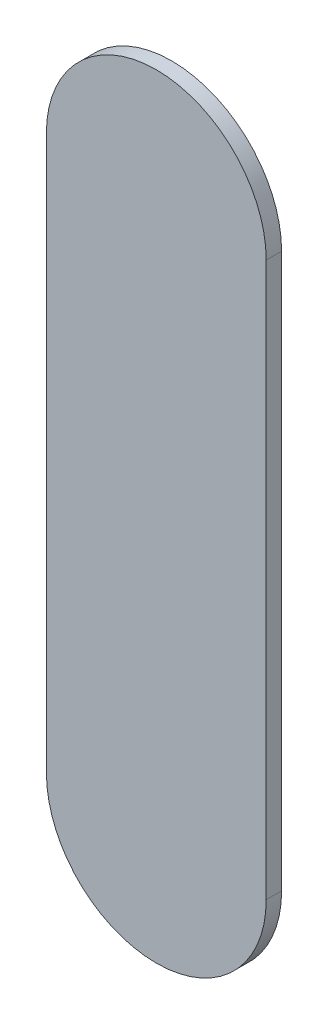
ISO-10303-21;
HEADER;
FILE_DESCRIPTION(('STEP AP214'),'2;1');
FILE_NAME('part.step','',(''),(''),'','','');
FILE_SCHEMA(('AUTOMOTIVE_DESIGN { 1 0 10303 214 1 1 1 1 }'));
ENDSEC;
DATA;
#1=APPLICATION_CONTEXT('core data for automotive mechanical design processes');
#2=APPLICATION_PROTOCOL_DEFINITION('international standard','automotive_design',2000,#1);
#3=PRODUCT_CONTEXT('',#1,'mechanical');
#4=PRODUCT('Part','Part','',(#3));
#5=PRODUCT_RELATED_PRODUCT_CATEGORY('part','',(#4));
#6=PRODUCT_DEFINITION_FORMATION('','',#4);
#7=PRODUCT_DEFINITION_CONTEXT('part definition',#1,'design');
#8=PRODUCT_DEFINITION('design','',#6,#7);
#9=PRODUCT_DEFINITION_SHAPE('','',#8);
#10=(LENGTH_UNIT() NAMED_UNIT(*) SI_UNIT(.MILLI.,.METRE.));
#11=(NAMED_UNIT(*) PLANE_ANGLE_UNIT() SI_UNIT($,.RADIAN.));
#12=(NAMED_UNIT(*) SI_UNIT($,.STERADIAN.) SOLID_ANGLE_UNIT());
#13=UNCERTAINTY_MEASURE_WITH_UNIT(LENGTH_MEASURE(1.E-05),#10,'distance_accuracy_value','');
#14=(GEOMETRIC_REPRESENTATION_CONTEXT(3) GLOBAL_UNCERTAINTY_ASSIGNED_CONTEXT((#13)) GLOBAL_UNIT_ASSIGNED_CONTEXT((#10,
#11,#12)) REPRESENTATION_CONTEXT('',''));
#15=CARTESIAN_POINT('',(0.,0.,0.));
#16=DIRECTION('',(0.,0.,1.));
#17=DIRECTION('',(1.,0.,0.));
#18=AXIS2_PLACEMENT_3D('',#15,#16,#17);
#19=CARTESIAN_POINT('',(121.03,-67.26,1.635));
#20=DIRECTION('',(0.,0.,1.));
#21=DIRECTION('',(1.,0.,0.));
#22=AXIS2_PLACEMENT_3D('',#19,#20,#21);
#23=PLANE('',#22);
#24=DIRECTION('',(0.,-1.,0.));
#25=VECTOR('',#24,1.);
#26=CARTESIAN_POINT('',(121.03,-67.26,1.635));
#27=LINE('',#26,#25);
#28=CARTESIAN_POINT('',(121.03,-67.26,1.635));
#29=VERTEX_POINT('',#28);
#30=CARTESIAN_POINT('',(121.03,-68.52,1.635));
#31=VERTEX_POINT('',#30);
#32=EDGE_CURVE('E91',#29,#31,#27,.T.);
#33=ORIENTED_EDGE('',*,*,#32,.T.);
#34=CARTESIAN_POINT('',(121.28,-68.52,1.635));
#35=DIRECTION('',(0.,0.,1.));
#36=DIRECTION('',(-1.,0.,0.));
#37=AXIS2_PLACEMENT_3D('',#34,#35,#36);
#38=CIRCLE('',#37,0.25);
#39=CARTESIAN_POINT('',(121.53,-68.52,1.635));
#40=VERTEX_POINT('',#39);
#41=EDGE_CURVE('E86',#31,#40,#38,.T.);
#42=ORIENTED_EDGE('',*,*,#41,.T.);
#43=DIRECTION('',(0.,1.,0.));
#44=VECTOR('',#43,1.);
#45=CARTESIAN_POINT('',(121.53,-68.52,1.635));
#46=LINE('',#45,#44);
#47=CARTESIAN_POINT('',(121.53,-67.26,1.635));
#48=VERTEX_POINT('',#47);
#49=EDGE_CURVE('E111',#40,#48,#46,.T.);
#50=ORIENTED_EDGE('',*,*,#49,.T.);
#51=CARTESIAN_POINT('',(121.28,-67.26,1.635));
#52=DIRECTION('',(0.,0.,1.));
#53=DIRECTION('',(1.,0.,0.));
#54=AXIS2_PLACEMENT_3D('',#51,#52,#53);
#55=CIRCLE('',#54,0.25);
#56=EDGE_CURVE('E11',#48,#29,#55,.T.);
#57=ORIENTED_EDGE('',*,*,#56,.T.);
#58=EDGE_LOOP('',(#33,#42,#50,#57));
#59=FACE_BOUND('',#58,.T.);
#60=ADVANCED_FACE('F17',(#59),#23,.T.);
#61=CARTESIAN_POINT('',(121.03,-67.26,1.6));
#62=DIRECTION('',(0.,0.,1.));
#63=DIRECTION('',(1.,0.,0.));
#64=AXIS2_PLACEMENT_3D('',#61,#62,#63);
#65=PLANE('',#64);
#66=CARTESIAN_POINT('',(121.28,-67.26,1.6));
#67=DIRECTION('',(0.,0.,1.));
#68=DIRECTION('',(1.,0.,0.));
#69=AXIS2_PLACEMENT_3D('',#66,#67,#68);
#70=CIRCLE('',#69,0.25);
#71=CARTESIAN_POINT('',(121.53,-67.26,1.6));
#72=VERTEX_POINT('',#71);
#73=CARTESIAN_POINT('',(121.03,-67.26,1.6));
#74=VERTEX_POINT('',#73);
#75=EDGE_CURVE('E20',#72,#74,#70,.T.);
#76=ORIENTED_EDGE('',*,*,#75,.F.);
#77=DIRECTION('',(0.,1.,0.));
#78=VECTOR('',#77,1.);
#79=CARTESIAN_POINT('',(121.53,-68.52,1.6));
#80=LINE('',#79,#78);
#81=CARTESIAN_POINT('',(121.53,-68.52,1.6));
#82=VERTEX_POINT('',#81);
#83=EDGE_CURVE('E74',#82,#72,#80,.T.);
#84=ORIENTED_EDGE('',*,*,#83,.F.);
#85=CARTESIAN_POINT('',(121.28,-68.52,1.6));
#86=DIRECTION('',(0.,0.,1.));
#87=DIRECTION('',(-1.,0.,0.));
#88=AXIS2_PLACEMENT_3D('',#85,#86,#87);
#89=CIRCLE('',#88,0.25);
#90=CARTESIAN_POINT('',(121.03,-68.52,1.6));
#91=VERTEX_POINT('',#90);
#92=EDGE_CURVE('E68',#91,#82,#89,.T.);
#93=ORIENTED_EDGE('',*,*,#92,.F.);
#94=DIRECTION('',(0.,-1.,0.));
#95=VECTOR('',#94,1.);
#96=CARTESIAN_POINT('',(121.03,-67.26,1.6));
#97=LINE('',#96,#95);
#98=EDGE_CURVE('E72',#74,#91,#97,.T.);
#99=ORIENTED_EDGE('',*,*,#98,.F.);
#100=EDGE_LOOP('',(#76,#84,#93,#99));
#101=FACE_BOUND('',#100,.T.);
#102=ADVANCED_FACE('F70',(#101),#65,.F.);
#103=CARTESIAN_POINT('',(121.28,-67.26,1.6));
#104=DIRECTION('',(0.,0.,-1.));
#105=DIRECTION('',(1.,0.,0.));
#106=AXIS2_PLACEMENT_3D('',#103,#104,#105);
#107=CYLINDRICAL_SURFACE('',#106,0.25);
#108=ORIENTED_EDGE('',*,*,#75,.T.);
#109=DIRECTION('',(0.,0.,1.));
#110=VECTOR('',#109,1.);
#111=CARTESIAN_POINT('',(121.03,-67.26,1.6));
#112=LINE('',#111,#110);
#113=EDGE_CURVE('E80',#74,#29,#112,.T.);
#114=ORIENTED_EDGE('',*,*,#113,.T.);
#115=ORIENTED_EDGE('',*,*,#56,.F.);
#116=DIRECTION('',(0.,0.,1.));
#117=VECTOR('',#116,1.);
#118=CARTESIAN_POINT('',(121.53,-67.26,1.6));
#119=LINE('',#118,#117);
#120=EDGE_CURVE('E107',#72,#48,#119,.T.);
#121=ORIENTED_EDGE('',*,*,#120,.F.);
#122=EDGE_LOOP('',(#108,#114,#115,#121));
#123=FACE_BOUND('',#122,.T.);
#124=ADVANCED_FACE('F122',(#123),#107,.T.);
#125=CARTESIAN_POINT('',(121.53,-68.52,1.6));
#126=DIRECTION('',(-1.,0.,0.));
#127=DIRECTION('',(0.,0.,1.));
#128=AXIS2_PLACEMENT_3D('',#125,#126,#127);
#129=PLANE('',#128);
#130=ORIENTED_EDGE('',*,*,#83,.T.);
#131=ORIENTED_EDGE('',*,*,#120,.T.);
#132=ORIENTED_EDGE('',*,*,#49,.F.);
#133=DIRECTION('',(0.,0.,1.));
#134=VECTOR('',#133,1.);
#135=CARTESIAN_POINT('',(121.53,-68.52,1.6));
#136=LINE('',#135,#134);
#137=EDGE_CURVE('E79',#82,#40,#136,.T.);
#138=ORIENTED_EDGE('',*,*,#137,.F.);
#139=EDGE_LOOP('',(#130,#131,#132,#138));
#140=FACE_BOUND('',#139,.T.);
#141=ADVANCED_FACE('F124',(#140),#129,.F.);
#142=CARTESIAN_POINT('',(121.28,-68.52,1.6));
#143=DIRECTION('',(0.,0.,-1.));
#144=DIRECTION('',(-1.,0.,0.));
#145=AXIS2_PLACEMENT_3D('',#142,#143,#144);
#146=CYLINDRICAL_SURFACE('',#145,0.25);
#147=ORIENTED_EDGE('',*,*,#92,.T.);
#148=ORIENTED_EDGE('',*,*,#137,.T.);
#149=ORIENTED_EDGE('',*,*,#41,.F.);
#150=DIRECTION('',(0.,0.,1.));
#151=VECTOR('',#150,1.);
#152=CARTESIAN_POINT('',(121.03,-68.52,1.6));
#153=LINE('',#152,#151);
#154=EDGE_CURVE('E83',#91,#31,#153,.T.);
#155=ORIENTED_EDGE('',*,*,#154,.F.);
#156=EDGE_LOOP('',(#147,#148,#149,#155));
#157=FACE_BOUND('',#156,.T.);
#158=ADVANCED_FACE('F84',(#157),#146,.T.);
#159=CARTESIAN_POINT('',(121.03,-67.26,1.6));
#160=DIRECTION('',(1.,0.,0.));
#161=DIRECTION('',(0.,1.,0.));
#162=AXIS2_PLACEMENT_3D('',#159,#160,#161);
#163=PLANE('',#162);
#164=ORIENTED_EDGE('',*,*,#98,.T.);
#165=ORIENTED_EDGE('',*,*,#154,.T.);
#166=ORIENTED_EDGE('',*,*,#32,.F.);
#167=ORIENTED_EDGE('',*,*,#113,.F.);
#168=EDGE_LOOP('',(#164,#165,#166,#167));
#169=FACE_BOUND('',#168,.T.);
#170=ADVANCED_FACE('F94',(#169),#163,.F.);
#171=CLOSED_SHELL('',(#60,#102,#124,#141,#158,#170));
#172=MANIFOLD_SOLID_BREP('B1',#171);
#173=ADVANCED_BREP_SHAPE_REPRESENTATION('',(#18,#172),#14);
#174=SHAPE_DEFINITION_REPRESENTATION(#9,#173);
ENDSEC;
END-ISO-10303-21;
